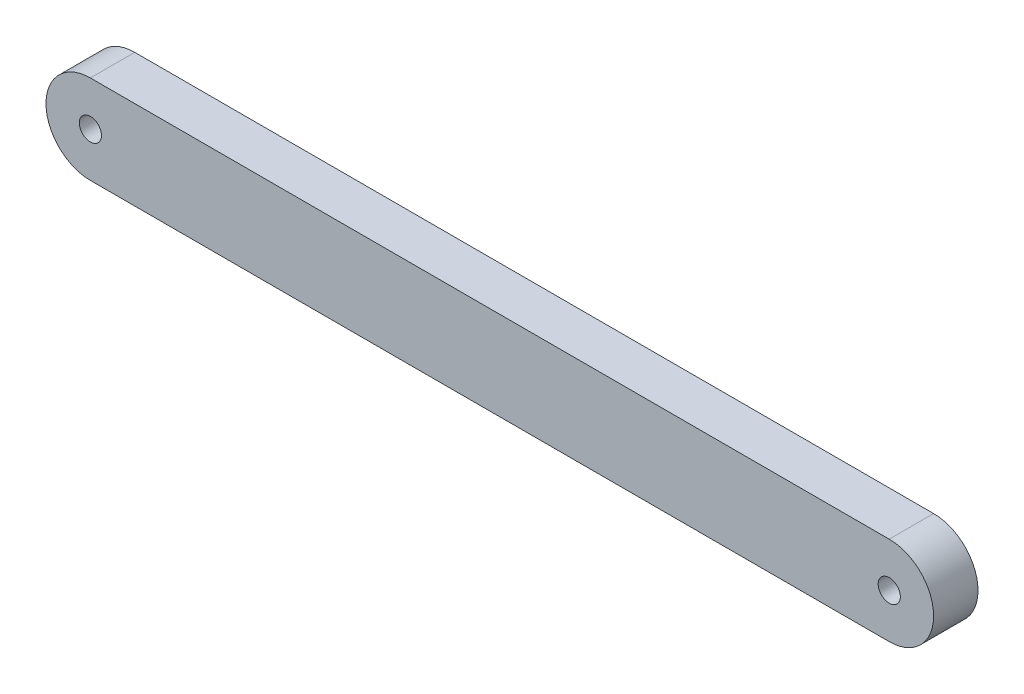
ISO-10303-21;
HEADER;
FILE_DESCRIPTION(('STEP AP214'),'2;1');
FILE_NAME('part.step','',(''),(''),'','','');
FILE_SCHEMA(('AUTOMOTIVE_DESIGN { 1 0 10303 214 1 1 1 1 }'));
ENDSEC;
DATA;
#1=APPLICATION_CONTEXT('core data for automotive mechanical design processes');
#2=APPLICATION_PROTOCOL_DEFINITION('international standard','automotive_design',2000,#1);
#3=PRODUCT_CONTEXT('',#1,'mechanical');
#4=PRODUCT('Part','Part','',(#3));
#5=PRODUCT_RELATED_PRODUCT_CATEGORY('part','',(#4));
#6=PRODUCT_DEFINITION_FORMATION('','',#4);
#7=PRODUCT_DEFINITION_CONTEXT('part definition',#1,'design');
#8=PRODUCT_DEFINITION('design','',#6,#7);
#9=PRODUCT_DEFINITION_SHAPE('','',#8);
#10=(LENGTH_UNIT() NAMED_UNIT(*) SI_UNIT(.MILLI.,.METRE.));
#11=(NAMED_UNIT(*) PLANE_ANGLE_UNIT() SI_UNIT($,.RADIAN.));
#12=(NAMED_UNIT(*) SI_UNIT($,.STERADIAN.) SOLID_ANGLE_UNIT());
#13=UNCERTAINTY_MEASURE_WITH_UNIT(LENGTH_MEASURE(1.E-05),#10,'distance_accuracy_value','');
#14=(GEOMETRIC_REPRESENTATION_CONTEXT(3) GLOBAL_UNCERTAINTY_ASSIGNED_CONTEXT((#13)) GLOBAL_UNIT_ASSIGNED_CONTEXT((#10,
#11,#12)) REPRESENTATION_CONTEXT('',''));
#15=CARTESIAN_POINT('',(0.,0.,0.));
#16=DIRECTION('',(0.,0.,1.));
#17=DIRECTION('',(1.,0.,0.));
#18=AXIS2_PLACEMENT_3D('',#15,#16,#17);
#19=CARTESIAN_POINT('',(180.,0.,10.));
#20=DIRECTION('',(0.,0.,1.));
#21=DIRECTION('',(1.,0.,0.));
#22=AXIS2_PLACEMENT_3D('',#19,#20,#21);
#23=PLANE('',#22);
#24=CARTESIAN_POINT('',(0.,0.,10.));
#25=DIRECTION('',(0.,0.,1.));
#26=DIRECTION('',(1.,0.,0.));
#27=AXIS2_PLACEMENT_3D('',#24,#25,#26);
#28=CIRCLE('',#27,2.5);
#29=CARTESIAN_POINT('',(2.5,0.,10.));
#30=VERTEX_POINT('',#29);
#31=EDGE_CURVE('E112',#30,#30,#28,.T.);
#32=ORIENTED_EDGE('',*,*,#31,.F.);
#33=EDGE_LOOP('',(#32));
#34=FACE_BOUND('',#33,.T.);
#35=CARTESIAN_POINT('',(180.,0.,10.));
#36=DIRECTION('',(0.,0.,1.));
#37=DIRECTION('',(1.,0.,0.));
#38=AXIS2_PLACEMENT_3D('',#35,#36,#37);
#39=CIRCLE('',#38,9.99999999999998);
#40=CARTESIAN_POINT('',(180.,-9.99999999999996,10.));
#41=VERTEX_POINT('',#40);
#42=CARTESIAN_POINT('',(180.,10.,10.));
#43=VERTEX_POINT('',#42);
#44=EDGE_CURVE('E92',#41,#43,#39,.T.);
#45=ORIENTED_EDGE('',*,*,#44,.T.);
#46=DIRECTION('',(-1.,0.,0.));
#47=VECTOR('',#46,1.);
#48=CARTESIAN_POINT('',(0.,10.,10.));
#49=LINE('',#48,#47);
#50=CARTESIAN_POINT('',(0.,10.,10.));
#51=VERTEX_POINT('',#50);
#52=EDGE_CURVE('E87',#43,#51,#49,.T.);
#53=ORIENTED_EDGE('',*,*,#52,.T.);
#54=CARTESIAN_POINT('',(0.,0.,10.));
#55=DIRECTION('',(0.,0.,1.));
#56=DIRECTION('',(-1.,0.,0.));
#57=AXIS2_PLACEMENT_3D('',#54,#55,#56);
#58=CIRCLE('',#57,10.);
#59=CARTESIAN_POINT('',(0.,-10.,10.));
#60=VERTEX_POINT('',#59);
#61=EDGE_CURVE('E90',#51,#60,#58,.T.);
#62=ORIENTED_EDGE('',*,*,#61,.T.);
#63=DIRECTION('',(1.,0.,0.));
#64=VECTOR('',#63,1.);
#65=CARTESIAN_POINT('',(180.,-9.99999999999996,10.));
#66=LINE('',#65,#64);
#67=EDGE_CURVE('E57',#60,#41,#66,.T.);
#68=ORIENTED_EDGE('',*,*,#67,.T.);
#69=EDGE_LOOP('',(#45,#53,#62,#68));
#70=FACE_BOUND('',#69,.T.);
#71=CARTESIAN_POINT('',(180.,0.,10.));
#72=DIRECTION('',(0.,0.,1.));
#73=DIRECTION('',(1.,0.,0.));
#74=AXIS2_PLACEMENT_3D('',#71,#72,#73);
#75=CIRCLE('',#74,2.5);
#76=CARTESIAN_POINT('',(182.5,0.,10.));
#77=VERTEX_POINT('',#76);
#78=EDGE_CURVE('E134',#77,#77,#75,.T.);
#79=ORIENTED_EDGE('',*,*,#78,.F.);
#80=EDGE_LOOP('',(#79));
#81=FACE_BOUND('',#80,.T.);
#82=ADVANCED_FACE('F39',(#34,#70,#81),#23,.T.);
#83=CARTESIAN_POINT('',(180.,0.,0.));
#84=DIRECTION('',(0.,0.,1.));
#85=DIRECTION('',(1.,0.,0.));
#86=AXIS2_PLACEMENT_3D('',#83,#84,#85);
#87=PLANE('',#86);
#88=CARTESIAN_POINT('',(180.,0.,0.));
#89=DIRECTION('',(0.,0.,1.));
#90=DIRECTION('',(1.,0.,0.));
#91=AXIS2_PLACEMENT_3D('',#88,#89,#90);
#92=CIRCLE('',#91,9.99999999999998);
#93=CARTESIAN_POINT('',(180.,-9.99999999999996,0.));
#94=VERTEX_POINT('',#93);
#95=CARTESIAN_POINT('',(180.,10.,0.));
#96=VERTEX_POINT('',#95);
#97=EDGE_CURVE('E108',#94,#96,#92,.T.);
#98=ORIENTED_EDGE('',*,*,#97,.F.);
#99=DIRECTION('',(1.,0.,0.));
#100=VECTOR('',#99,1.);
#101=CARTESIAN_POINT('',(180.,-9.99999999999996,0.));
#102=LINE('',#101,#100);
#103=CARTESIAN_POINT('',(0.,-10.,0.));
#104=VERTEX_POINT('',#103);
#105=EDGE_CURVE('E80',#104,#94,#102,.T.);
#106=ORIENTED_EDGE('',*,*,#105,.F.);
#107=CARTESIAN_POINT('',(0.,0.,0.));
#108=DIRECTION('',(0.,0.,1.));
#109=DIRECTION('',(-1.,0.,0.));
#110=AXIS2_PLACEMENT_3D('',#107,#108,#109);
#111=CIRCLE('',#110,10.);
#112=CARTESIAN_POINT('',(0.,10.,0.));
#113=VERTEX_POINT('',#112);
#114=EDGE_CURVE('E74',#113,#104,#111,.T.);
#115=ORIENTED_EDGE('',*,*,#114,.F.);
#116=DIRECTION('',(-1.,0.,0.));
#117=VECTOR('',#116,1.);
#118=CARTESIAN_POINT('',(0.,10.,0.));
#119=LINE('',#118,#117);
#120=EDGE_CURVE('E97',#96,#113,#119,.T.);
#121=ORIENTED_EDGE('',*,*,#120,.F.);
#122=EDGE_LOOP('',(#98,#106,#115,#121));
#123=FACE_BOUND('',#122,.T.);
#124=CARTESIAN_POINT('',(0.,0.,0.));
#125=DIRECTION('',(0.,0.,1.));
#126=DIRECTION('',(1.,0.,0.));
#127=AXIS2_PLACEMENT_3D('',#124,#125,#126);
#128=CIRCLE('',#127,2.5);
#129=CARTESIAN_POINT('',(2.5,0.,0.));
#130=VERTEX_POINT('',#129);
#131=EDGE_CURVE('E130',#130,#130,#128,.T.);
#132=ORIENTED_EDGE('',*,*,#131,.T.);
#133=EDGE_LOOP('',(#132));
#134=FACE_BOUND('',#133,.T.);
#135=CARTESIAN_POINT('',(180.,0.,0.));
#136=DIRECTION('',(0.,0.,1.));
#137=DIRECTION('',(1.,0.,0.));
#138=AXIS2_PLACEMENT_3D('',#135,#136,#137);
#139=CIRCLE('',#138,2.5);
#140=CARTESIAN_POINT('',(182.5,0.,0.));
#141=VERTEX_POINT('',#140);
#142=EDGE_CURVE('E138',#141,#141,#139,.T.);
#143=ORIENTED_EDGE('',*,*,#142,.T.);
#144=EDGE_LOOP('',(#143));
#145=FACE_BOUND('',#144,.T.);
#146=ADVANCED_FACE('F125',(#123,#134,#145),#87,.F.);
#147=CARTESIAN_POINT('',(180.,0.,10.));
#148=DIRECTION('',(0.,0.,-1.));
#149=DIRECTION('',(-1.,0.,0.));
#150=AXIS2_PLACEMENT_3D('',#147,#148,#149);
#151=CYLINDRICAL_SURFACE('',#150,9.99999999999998);
#152=ORIENTED_EDGE('',*,*,#97,.T.);
#153=DIRECTION('',(0.,0.,-1.));
#154=VECTOR('',#153,1.);
#155=CARTESIAN_POINT('',(180.,10.,10.));
#156=LINE('',#155,#154);
#157=EDGE_CURVE('E11',#43,#96,#156,.T.);
#158=ORIENTED_EDGE('',*,*,#157,.F.);
#159=ORIENTED_EDGE('',*,*,#44,.F.);
#160=DIRECTION('',(0.,0.,-1.));
#161=VECTOR('',#160,1.);
#162=CARTESIAN_POINT('',(180.,-9.99999999999996,10.));
#163=LINE('',#162,#161);
#164=EDGE_CURVE('E104',#41,#94,#163,.T.);
#165=ORIENTED_EDGE('',*,*,#164,.T.);
#166=EDGE_LOOP('',(#152,#158,#159,#165));
#167=FACE_BOUND('',#166,.T.);
#168=ADVANCED_FACE('F41',(#167),#151,.T.);
#169=CARTESIAN_POINT('',(0.,10.,10.));
#170=DIRECTION('',(0.,-1.,0.));
#171=DIRECTION('',(0.,0.,-1.));
#172=AXIS2_PLACEMENT_3D('',#169,#170,#171);
#173=PLANE('',#172);
#174=ORIENTED_EDGE('',*,*,#120,.T.);
#175=DIRECTION('',(0.,0.,-1.));
#176=VECTOR('',#175,1.);
#177=CARTESIAN_POINT('',(0.,10.,10.));
#178=LINE('',#177,#176);
#179=EDGE_CURVE('E49',#51,#113,#178,.T.);
#180=ORIENTED_EDGE('',*,*,#179,.F.);
#181=ORIENTED_EDGE('',*,*,#52,.F.);
#182=ORIENTED_EDGE('',*,*,#157,.T.);
#183=EDGE_LOOP('',(#174,#180,#181,#182));
#184=FACE_BOUND('',#183,.T.);
#185=ADVANCED_FACE('F96',(#184),#173,.F.);
#186=CARTESIAN_POINT('',(0.,0.,10.));
#187=DIRECTION('',(0.,0.,-1.));
#188=DIRECTION('',(-1.,0.,0.));
#189=AXIS2_PLACEMENT_3D('',#186,#187,#188);
#190=CYLINDRICAL_SURFACE('',#189,10.);
#191=ORIENTED_EDGE('',*,*,#114,.T.);
#192=DIRECTION('',(0.,0.,-1.));
#193=VECTOR('',#192,1.);
#194=CARTESIAN_POINT('',(0.,-10.,10.));
#195=LINE('',#194,#193);
#196=EDGE_CURVE('E99',#60,#104,#195,.T.);
#197=ORIENTED_EDGE('',*,*,#196,.F.);
#198=ORIENTED_EDGE('',*,*,#61,.F.);
#199=ORIENTED_EDGE('',*,*,#179,.T.);
#200=EDGE_LOOP('',(#191,#197,#198,#199));
#201=FACE_BOUND('',#200,.T.);
#202=ADVANCED_FACE('F100',(#201),#190,.T.);
#203=CARTESIAN_POINT('',(180.,-9.99999999999996,10.));
#204=DIRECTION('',(0.,1.,0.));
#205=DIRECTION('',(-1.,0.,0.));
#206=AXIS2_PLACEMENT_3D('',#203,#204,#205);
#207=PLANE('',#206);
#208=ORIENTED_EDGE('',*,*,#105,.T.);
#209=ORIENTED_EDGE('',*,*,#164,.F.);
#210=ORIENTED_EDGE('',*,*,#67,.F.);
#211=ORIENTED_EDGE('',*,*,#196,.T.);
#212=EDGE_LOOP('',(#208,#209,#210,#211));
#213=FACE_BOUND('',#212,.T.);
#214=ADVANCED_FACE('F122',(#213),#207,.F.);
#215=CARTESIAN_POINT('',(0.,0.,10.));
#216=DIRECTION('',(0.,0.,-1.));
#217=DIRECTION('',(-1.,0.,0.));
#218=AXIS2_PLACEMENT_3D('',#215,#216,#217);
#219=CYLINDRICAL_SURFACE('',#218,2.5);
#220=ORIENTED_EDGE('',*,*,#31,.T.);
#221=EDGE_LOOP('',(#220));
#222=FACE_BOUND('',#221,.T.);
#223=ORIENTED_EDGE('',*,*,#131,.F.);
#224=EDGE_LOOP('',(#223));
#225=FACE_BOUND('',#224,.T.);
#226=ADVANCED_FACE('F157',(#222,#225),#219,.F.);
#227=CARTESIAN_POINT('',(180.,0.,10.));
#228=DIRECTION('',(0.,0.,-1.));
#229=DIRECTION('',(-1.,0.,0.));
#230=AXIS2_PLACEMENT_3D('',#227,#228,#229);
#231=CYLINDRICAL_SURFACE('',#230,2.5);
#232=ORIENTED_EDGE('',*,*,#78,.T.);
#233=EDGE_LOOP('',(#232));
#234=FACE_BOUND('',#233,.T.);
#235=ORIENTED_EDGE('',*,*,#142,.F.);
#236=EDGE_LOOP('',(#235));
#237=FACE_BOUND('',#236,.T.);
#238=ADVANCED_FACE('F146',(#234,#237),#231,.F.);
#239=CLOSED_SHELL('',(#82,#146,#168,#185,#202,#214,#226,#238));
#240=MANIFOLD_SOLID_BREP('B2',#239);
#241=ADVANCED_BREP_SHAPE_REPRESENTATION('',(#18,#240),#14);
#242=SHAPE_DEFINITION_REPRESENTATION(#9,#241);
ENDSEC;
END-ISO-10303-21;
